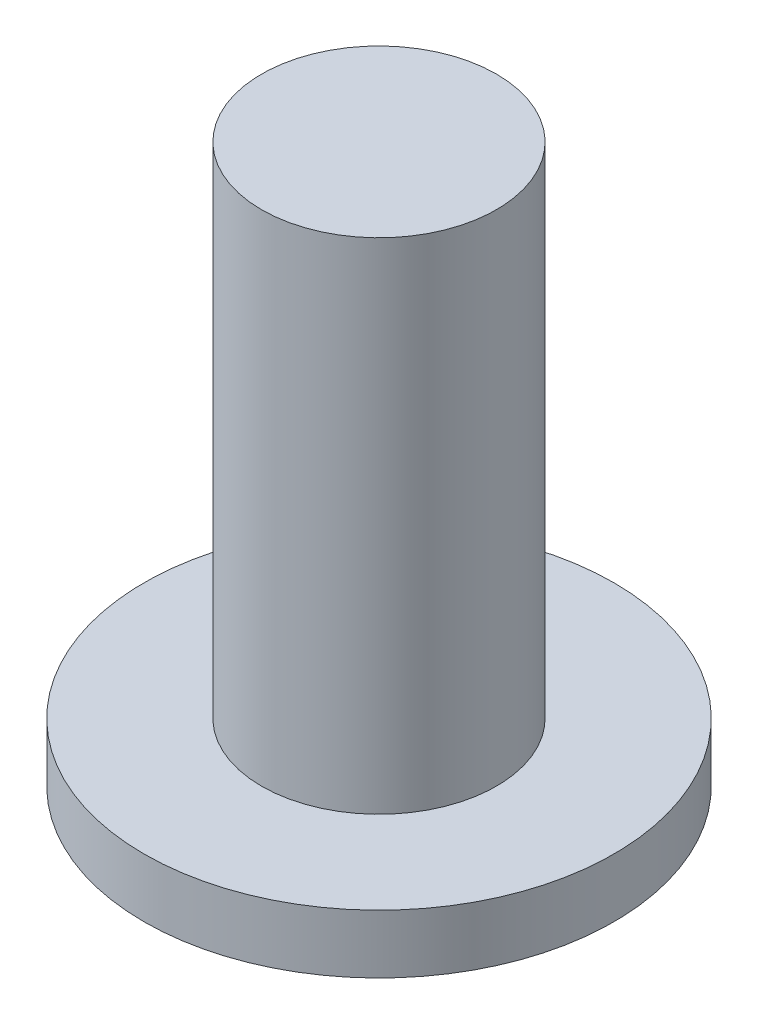
ISO-10303-21;
HEADER;
FILE_DESCRIPTION(('STEP AP214'),'2;1');
FILE_NAME('part.step','',(''),(''),'','','');
FILE_SCHEMA(('AUTOMOTIVE_DESIGN { 1 0 10303 214 1 1 1 1 }'));
ENDSEC;
DATA;
#1=APPLICATION_CONTEXT('core data for automotive mechanical design processes');
#2=APPLICATION_PROTOCOL_DEFINITION('international standard','automotive_design',2000,#1);
#3=PRODUCT_CONTEXT('',#1,'mechanical');
#4=PRODUCT('Part','Part','',(#3));
#5=PRODUCT_RELATED_PRODUCT_CATEGORY('part','',(#4));
#6=PRODUCT_DEFINITION_FORMATION('','',#4);
#7=PRODUCT_DEFINITION_CONTEXT('part definition',#1,'design');
#8=PRODUCT_DEFINITION('design','',#6,#7);
#9=PRODUCT_DEFINITION_SHAPE('','',#8);
#10=(LENGTH_UNIT() NAMED_UNIT(*) SI_UNIT(.MILLI.,.METRE.));
#11=(NAMED_UNIT(*) PLANE_ANGLE_UNIT() SI_UNIT($,.RADIAN.));
#12=(NAMED_UNIT(*) SI_UNIT($,.STERADIAN.) SOLID_ANGLE_UNIT());
#13=UNCERTAINTY_MEASURE_WITH_UNIT(LENGTH_MEASURE(1.E-05),#10,'distance_accuracy_value','');
#14=(GEOMETRIC_REPRESENTATION_CONTEXT(3) GLOBAL_UNCERTAINTY_ASSIGNED_CONTEXT((#13)) GLOBAL_UNIT_ASSIGNED_CONTEXT((#10,
#11,#12)) REPRESENTATION_CONTEXT('',''));
#15=CARTESIAN_POINT('',(0.,0.,0.));
#16=DIRECTION('',(0.,0.,1.));
#17=DIRECTION('',(1.,0.,0.));
#18=AXIS2_PLACEMENT_3D('',#15,#16,#17);
#19=CARTESIAN_POINT('',(0.,293.920335429769,0.));
#20=DIRECTION('',(0.,1.,0.));
#21=DIRECTION('',(0.,0.,1.));
#22=AXIS2_PLACEMENT_3D('',#19,#20,#21);
#23=CYLINDRICAL_SURFACE('',#22,99.9999999999999);
#24=CARTESIAN_POINT('',(0.,-200.,0.));
#25=DIRECTION('',(0.,1.,0.));
#26=DIRECTION('',(0.,0.,1.));
#27=AXIS2_PLACEMENT_3D('',#24,#25,#26);
#28=CIRCLE('',#27,99.9999999999999);
#29=CARTESIAN_POINT('',(0.,-200.,99.9999999999999));
#30=VERTEX_POINT('',#29);
#31=EDGE_CURVE('E45',#30,#30,#28,.T.);
#32=ORIENTED_EDGE('',*,*,#31,.T.);
#33=EDGE_LOOP('',(#32));
#34=FACE_BOUND('',#33,.T.);
#35=CARTESIAN_POINT('',(0.,225.,0.));
#36=DIRECTION('',(0.,1.,0.));
#37=DIRECTION('',(0.,0.,1.));
#38=AXIS2_PLACEMENT_3D('',#35,#36,#37);
#39=CIRCLE('',#38,99.9999999999999);
#40=CARTESIAN_POINT('',(0.,225.,99.9999999999999));
#41=VERTEX_POINT('',#40);
#42=EDGE_CURVE('E10',#41,#41,#39,.T.);
#43=ORIENTED_EDGE('',*,*,#42,.F.);
#44=EDGE_LOOP('',(#43));
#45=FACE_BOUND('',#44,.T.);
#46=ADVANCED_FACE('F31',(#34,#45),#23,.T.);
#47=CARTESIAN_POINT('',(0.,225.,99.9999999999999));
#48=DIRECTION('',(0.,1.,0.));
#49=DIRECTION('',(0.,0.,1.));
#50=AXIS2_PLACEMENT_3D('',#47,#48,#49);
#51=PLANE('',#50);
#52=ORIENTED_EDGE('',*,*,#42,.T.);
#53=EDGE_LOOP('',(#52));
#54=FACE_BOUND('',#53,.T.);
#55=ADVANCED_FACE('F64',(#54),#51,.T.);
#56=CARTESIAN_POINT('',(0.,-250.,200.));
#57=DIRECTION('',(0.,-1.,0.));
#58=DIRECTION('',(0.,0.,-1.));
#59=AXIS2_PLACEMENT_3D('',#56,#57,#58);
#60=PLANE('',#59);
#61=CARTESIAN_POINT('',(0.,-250.,0.));
#62=DIRECTION('',(0.,1.,0.));
#63=DIRECTION('',(0.,0.,1.));
#64=AXIS2_PLACEMENT_3D('',#61,#62,#63);
#65=CIRCLE('',#64,200.);
#66=CARTESIAN_POINT('',(0.,-250.,200.));
#67=VERTEX_POINT('',#66);
#68=EDGE_CURVE('E37',#67,#67,#65,.T.);
#69=ORIENTED_EDGE('',*,*,#68,.F.);
#70=EDGE_LOOP('',(#69));
#71=FACE_BOUND('',#70,.T.);
#72=ADVANCED_FACE('F61',(#71),#60,.T.);
#73=CARTESIAN_POINT('',(0.,293.920335429769,0.));
#74=DIRECTION('',(0.,1.,0.));
#75=DIRECTION('',(0.,0.,1.));
#76=AXIS2_PLACEMENT_3D('',#73,#74,#75);
#77=CYLINDRICAL_SURFACE('',#76,200.);
#78=ORIENTED_EDGE('',*,*,#68,.T.);
#79=EDGE_LOOP('',(#78));
#80=FACE_BOUND('',#79,.T.);
#81=CARTESIAN_POINT('',(0.,-200.,0.));
#82=DIRECTION('',(0.,1.,0.));
#83=DIRECTION('',(0.,0.,1.));
#84=AXIS2_PLACEMENT_3D('',#81,#82,#83);
#85=CIRCLE('',#84,200.);
#86=CARTESIAN_POINT('',(0.,-200.,200.));
#87=VERTEX_POINT('',#86);
#88=EDGE_CURVE('E41',#87,#87,#85,.T.);
#89=ORIENTED_EDGE('',*,*,#88,.F.);
#90=EDGE_LOOP('',(#89));
#91=FACE_BOUND('',#90,.T.);
#92=ADVANCED_FACE('F55',(#80,#91),#77,.T.);
#93=CARTESIAN_POINT('',(0.,-200.,99.9999999999999));
#94=DIRECTION('',(0.,1.,0.));
#95=DIRECTION('',(0.,0.,1.));
#96=AXIS2_PLACEMENT_3D('',#93,#94,#95);
#97=PLANE('',#96);
#98=ORIENTED_EDGE('',*,*,#88,.T.);
#99=EDGE_LOOP('',(#98));
#100=FACE_BOUND('',#99,.T.);
#101=ORIENTED_EDGE('',*,*,#31,.F.);
#102=EDGE_LOOP('',(#101));
#103=FACE_BOUND('',#102,.T.);
#104=ADVANCED_FACE('F53',(#100,#103),#97,.T.);
#105=CLOSED_SHELL('',(#46,#55,#72,#92,#104));
#106=MANIFOLD_SOLID_BREP('B2',#105);
#107=ADVANCED_BREP_SHAPE_REPRESENTATION('',(#18,#106),#14);
#108=SHAPE_DEFINITION_REPRESENTATION(#9,#107);
ENDSEC;
END-ISO-10303-21;
